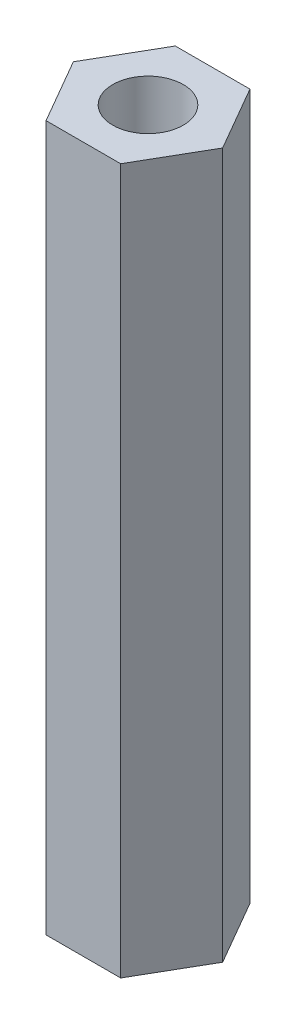
ISO-10303-21;
HEADER;
FILE_DESCRIPTION(('STEP AP214'),'2;1');
FILE_NAME('part.step','',(''),(''),'','','');
FILE_SCHEMA(('AUTOMOTIVE_DESIGN { 1 0 10303 214 1 1 1 1 }'));
ENDSEC;
DATA;
#1=APPLICATION_CONTEXT('core data for automotive mechanical design processes');
#2=APPLICATION_PROTOCOL_DEFINITION('international standard','automotive_design',2000,#1);
#3=PRODUCT_CONTEXT('',#1,'mechanical');
#4=PRODUCT('Part','Part','',(#3));
#5=PRODUCT_RELATED_PRODUCT_CATEGORY('part','',(#4));
#6=PRODUCT_DEFINITION_FORMATION('','',#4);
#7=PRODUCT_DEFINITION_CONTEXT('part definition',#1,'design');
#8=PRODUCT_DEFINITION('design','',#6,#7);
#9=PRODUCT_DEFINITION_SHAPE('','',#8);
#10=(LENGTH_UNIT() NAMED_UNIT(*) SI_UNIT(.MILLI.,.METRE.));
#11=(NAMED_UNIT(*) PLANE_ANGLE_UNIT() SI_UNIT($,.RADIAN.));
#12=(NAMED_UNIT(*) SI_UNIT($,.STERADIAN.) SOLID_ANGLE_UNIT());
#13=UNCERTAINTY_MEASURE_WITH_UNIT(LENGTH_MEASURE(1.E-05),#10,'distance_accuracy_value','');
#14=(GEOMETRIC_REPRESENTATION_CONTEXT(3) GLOBAL_UNCERTAINTY_ASSIGNED_CONTEXT((#13)) GLOBAL_UNIT_ASSIGNED_CONTEXT((#10,
#11,#12)) REPRESENTATION_CONTEXT('',''));
#15=CARTESIAN_POINT('',(0.,0.,0.));
#16=DIRECTION('',(0.,0.,1.));
#17=DIRECTION('',(1.,0.,0.));
#18=AXIS2_PLACEMENT_3D('',#15,#16,#17);
#19=CARTESIAN_POINT('',(1.5877132402715,30.,2.74999999999997));
#20=DIRECTION('',(-0.866025403784441,0.,-0.499999999999995));
#21=DIRECTION('',(-0.499999999999995,0.,0.866025403784442));
#22=AXIS2_PLACEMENT_3D('',#19,#20,#21);
#23=PLANE('',#22);
#24=DIRECTION('',(0.499999999999995,0.,-0.866025403784441));
#25=VECTOR('',#24,1.);
#26=CARTESIAN_POINT('',(1.5877132402715,0.,2.74999999999997));
#27=LINE('',#26,#25);
#28=CARTESIAN_POINT('',(1.5877132402715,0.,2.74999999999997));
#29=VERTEX_POINT('',#28);
#30=CARTESIAN_POINT('',(3.17542648054293,0.,0.));
#31=VERTEX_POINT('',#30);
#32=EDGE_CURVE('E117',#29,#31,#27,.T.);
#33=ORIENTED_EDGE('',*,*,#32,.T.);
#34=DIRECTION('',(0.,-1.,0.));
#35=VECTOR('',#34,1.);
#36=CARTESIAN_POINT('',(3.17542648054293,30.,0.));
#37=LINE('',#36,#35);
#38=CARTESIAN_POINT('',(3.17542648054293,30.,0.));
#39=VERTEX_POINT('',#38);
#40=EDGE_CURVE('E11',#39,#31,#37,.T.);
#41=ORIENTED_EDGE('',*,*,#40,.F.);
#42=DIRECTION('',(0.499999999999995,0.,-0.866025403784441));
#43=VECTOR('',#42,1.);
#44=CARTESIAN_POINT('',(1.5877132402715,30.,2.74999999999997));
#45=LINE('',#44,#43);
#46=CARTESIAN_POINT('',(1.5877132402715,30.,2.74999999999997));
#47=VERTEX_POINT('',#46);
#48=EDGE_CURVE('E128',#47,#39,#45,.T.);
#49=ORIENTED_EDGE('',*,*,#48,.F.);
#50=DIRECTION('',(0.,-1.,0.));
#51=VECTOR('',#50,1.);
#52=CARTESIAN_POINT('',(1.5877132402715,30.,2.74999999999997));
#53=LINE('',#52,#51);
#54=EDGE_CURVE('E113',#47,#29,#53,.T.);
#55=ORIENTED_EDGE('',*,*,#54,.T.);
#56=EDGE_LOOP('',(#33,#41,#49,#55));
#57=FACE_BOUND('',#56,.T.);
#58=ADVANCED_FACE('F33',(#57),#23,.F.);
#59=CARTESIAN_POINT('',(3.17542648054293,30.,0.));
#60=DIRECTION('',(-0.866025403784438,0.,0.500000000000001));
#61=DIRECTION('',(0.500000000000001,0.,0.866025403784438));
#62=AXIS2_PLACEMENT_3D('',#59,#60,#61);
#63=PLANE('',#62);
#64=DIRECTION('',(-0.500000000000001,0.,-0.866025403784438));
#65=VECTOR('',#64,1.);
#66=CARTESIAN_POINT('',(3.17542648054293,0.,0.));
#67=LINE('',#66,#65);
#68=CARTESIAN_POINT('',(1.58771324027146,0.,-2.74999999999999));
#69=VERTEX_POINT('',#68);
#70=EDGE_CURVE('E120',#31,#69,#67,.T.);
#71=ORIENTED_EDGE('',*,*,#70,.T.);
#72=DIRECTION('',(0.,-1.,0.));
#73=VECTOR('',#72,1.);
#74=CARTESIAN_POINT('',(1.58771324027146,30.,-2.74999999999999));
#75=LINE('',#74,#73);
#76=CARTESIAN_POINT('',(1.58771324027146,30.,-2.74999999999999));
#77=VERTEX_POINT('',#76);
#78=EDGE_CURVE('E41',#77,#69,#75,.T.);
#79=ORIENTED_EDGE('',*,*,#78,.F.);
#80=DIRECTION('',(-0.500000000000001,0.,-0.866025403784438));
#81=VECTOR('',#80,1.);
#82=CARTESIAN_POINT('',(3.17542648054293,30.,0.));
#83=LINE('',#82,#81);
#84=EDGE_CURVE('E86',#39,#77,#83,.T.);
#85=ORIENTED_EDGE('',*,*,#84,.F.);
#86=ORIENTED_EDGE('',*,*,#40,.T.);
#87=EDGE_LOOP('',(#71,#79,#85,#86));
#88=FACE_BOUND('',#87,.T.);
#89=ADVANCED_FACE('F153',(#88),#63,.F.);
#90=CARTESIAN_POINT('',(1.58771324027146,30.,-2.74999999999999));
#91=DIRECTION('',(0.,0.,1.));
#92=DIRECTION('',(1.,0.,0.));
#93=AXIS2_PLACEMENT_3D('',#90,#91,#92);
#94=PLANE('',#93);
#95=DIRECTION('',(-1.,0.,0.));
#96=VECTOR('',#95,1.);
#97=CARTESIAN_POINT('',(1.58771324027146,0.,-2.74999999999999));
#98=LINE('',#97,#96);
#99=CARTESIAN_POINT('',(-1.58771324027148,0.,-2.74999999999998));
#100=VERTEX_POINT('',#99);
#101=EDGE_CURVE('E123',#69,#100,#98,.T.);
#102=ORIENTED_EDGE('',*,*,#101,.T.);
#103=DIRECTION('',(0.,-1.,0.));
#104=VECTOR('',#103,1.);
#105=CARTESIAN_POINT('',(-1.58771324027148,30.,-2.74999999999998));
#106=LINE('',#105,#104);
#107=CARTESIAN_POINT('',(-1.58771324027148,30.,-2.74999999999998));
#108=VERTEX_POINT('',#107);
#109=EDGE_CURVE('E108',#108,#100,#106,.T.);
#110=ORIENTED_EDGE('',*,*,#109,.F.);
#111=DIRECTION('',(-1.,0.,0.));
#112=VECTOR('',#111,1.);
#113=CARTESIAN_POINT('',(1.58771324027146,30.,-2.74999999999999));
#114=LINE('',#113,#112);
#115=EDGE_CURVE('E99',#77,#108,#114,.T.);
#116=ORIENTED_EDGE('',*,*,#115,.F.);
#117=ORIENTED_EDGE('',*,*,#78,.T.);
#118=EDGE_LOOP('',(#102,#110,#116,#117));
#119=FACE_BOUND('',#118,.T.);
#120=ADVANCED_FACE('F134',(#119),#94,.F.);
#121=CARTESIAN_POINT('',(-1.58771324027148,30.,-2.74999999999998));
#122=DIRECTION('',(0.866025403784442,0.,0.499999999999995));
#123=DIRECTION('',(0.499999999999995,0.,-0.866025403784442));
#124=AXIS2_PLACEMENT_3D('',#121,#122,#123);
#125=PLANE('',#124);
#126=DIRECTION('',(-0.499999999999995,0.,0.866025403784442));
#127=VECTOR('',#126,1.);
#128=CARTESIAN_POINT('',(-1.58771324027148,0.,-2.74999999999998));
#129=LINE('',#128,#127);
#130=CARTESIAN_POINT('',(-3.17542648054293,0.,0.));
#131=VERTEX_POINT('',#130);
#132=EDGE_CURVE('E107',#100,#131,#129,.T.);
#133=ORIENTED_EDGE('',*,*,#132,.T.);
#134=DIRECTION('',(0.,-1.,0.));
#135=VECTOR('',#134,1.);
#136=CARTESIAN_POINT('',(-3.17542648054293,30.,0.));
#137=LINE('',#136,#135);
#138=CARTESIAN_POINT('',(-3.17542648054293,30.,0.));
#139=VERTEX_POINT('',#138);
#140=EDGE_CURVE('E104',#139,#131,#137,.T.);
#141=ORIENTED_EDGE('',*,*,#140,.F.);
#142=DIRECTION('',(-0.499999999999995,0.,0.866025403784442));
#143=VECTOR('',#142,1.);
#144=CARTESIAN_POINT('',(-1.58771324027148,30.,-2.74999999999998));
#145=LINE('',#144,#143);
#146=EDGE_CURVE('E93',#108,#139,#145,.T.);
#147=ORIENTED_EDGE('',*,*,#146,.F.);
#148=ORIENTED_EDGE('',*,*,#109,.T.);
#149=EDGE_LOOP('',(#133,#141,#147,#148));
#150=FACE_BOUND('',#149,.T.);
#151=ADVANCED_FACE('F105',(#150),#125,.F.);
#152=CARTESIAN_POINT('',(-3.17542648054293,30.,0.));
#153=DIRECTION('',(0.866025403784435,0.,-0.500000000000007));
#154=DIRECTION('',(-0.500000000000007,0.,-0.866025403784435));
#155=AXIS2_PLACEMENT_3D('',#152,#153,#154);
#156=PLANE('',#155);
#157=DIRECTION('',(0.500000000000007,0.,0.866025403784435));
#158=VECTOR('',#157,1.);
#159=CARTESIAN_POINT('',(-3.17542648054293,0.,0.));
#160=LINE('',#159,#158);
#161=CARTESIAN_POINT('',(-1.58771324027144,0.,2.75));
#162=VERTEX_POINT('',#161);
#163=EDGE_CURVE('E72',#131,#162,#160,.T.);
#164=ORIENTED_EDGE('',*,*,#163,.T.);
#165=DIRECTION('',(0.,-1.,0.));
#166=VECTOR('',#165,1.);
#167=CARTESIAN_POINT('',(-1.58771324027144,30.,2.75));
#168=LINE('',#167,#166);
#169=CARTESIAN_POINT('',(-1.58771324027144,30.,2.75));
#170=VERTEX_POINT('',#169);
#171=EDGE_CURVE('E109',#170,#162,#168,.T.);
#172=ORIENTED_EDGE('',*,*,#171,.F.);
#173=DIRECTION('',(0.500000000000007,0.,0.866025403784435));
#174=VECTOR('',#173,1.);
#175=CARTESIAN_POINT('',(-3.17542648054293,30.,0.));
#176=LINE('',#175,#174);
#177=EDGE_CURVE('E97',#139,#170,#176,.T.);
#178=ORIENTED_EDGE('',*,*,#177,.F.);
#179=ORIENTED_EDGE('',*,*,#140,.T.);
#180=EDGE_LOOP('',(#164,#172,#178,#179));
#181=FACE_BOUND('',#180,.T.);
#182=ADVANCED_FACE('F111',(#181),#156,.F.);
#183=CARTESIAN_POINT('',(-1.58771324027144,30.,2.75));
#184=DIRECTION('',(0.,0.,-1.));
#185=DIRECTION('',(-1.,0.,0.));
#186=AXIS2_PLACEMENT_3D('',#183,#184,#185);
#187=PLANE('',#186);
#188=DIRECTION('',(1.,0.,0.));
#189=VECTOR('',#188,1.);
#190=CARTESIAN_POINT('',(-1.58771324027144,0.,2.75));
#191=LINE('',#190,#189);
#192=EDGE_CURVE('E78',#162,#29,#191,.T.);
#193=ORIENTED_EDGE('',*,*,#192,.T.);
#194=ORIENTED_EDGE('',*,*,#54,.F.);
#195=DIRECTION('',(1.,0.,0.));
#196=VECTOR('',#195,1.);
#197=CARTESIAN_POINT('',(-1.58771324027144,30.,2.75));
#198=LINE('',#197,#196);
#199=EDGE_CURVE('E49',#170,#47,#198,.T.);
#200=ORIENTED_EDGE('',*,*,#199,.F.);
#201=ORIENTED_EDGE('',*,*,#171,.T.);
#202=EDGE_LOOP('',(#193,#194,#200,#201));
#203=FACE_BOUND('',#202,.T.);
#204=ADVANCED_FACE('F141',(#203),#187,.F.);
#205=CARTESIAN_POINT('',(0.,30.,0.));
#206=DIRECTION('',(0.,1.,0.));
#207=DIRECTION('',(0.,0.,1.));
#208=AXIS2_PLACEMENT_3D('',#205,#206,#207);
#209=PLANE('',#208);
#210=CARTESIAN_POINT('',(0.,30.,0.));
#211=DIRECTION('',(0.,1.,0.));
#212=DIRECTION('',(0.,0.,1.));
#213=AXIS2_PLACEMENT_3D('',#210,#211,#212);
#214=CIRCLE('',#213,1.5);
#215=CARTESIAN_POINT('',(0.,30.,1.5));
#216=VERTEX_POINT('',#215);
#217=EDGE_CURVE('E236',#216,#216,#214,.T.);
#218=ORIENTED_EDGE('',*,*,#217,.F.);
#219=EDGE_LOOP('',(#218));
#220=FACE_BOUND('',#219,.T.);
#221=ORIENTED_EDGE('',*,*,#48,.T.);
#222=ORIENTED_EDGE('',*,*,#84,.T.);
#223=ORIENTED_EDGE('',*,*,#115,.T.);
#224=ORIENTED_EDGE('',*,*,#146,.T.);
#225=ORIENTED_EDGE('',*,*,#177,.T.);
#226=ORIENTED_EDGE('',*,*,#199,.T.);
#227=EDGE_LOOP('',(#221,#222,#223,#224,#225,#226));
#228=FACE_BOUND('',#227,.T.);
#229=ADVANCED_FACE('F95',(#220,#228),#209,.T.);
#230=CARTESIAN_POINT('',(0.,0.,0.));
#231=DIRECTION('',(0.,1.,0.));
#232=DIRECTION('',(0.,0.,1.));
#233=AXIS2_PLACEMENT_3D('',#230,#231,#232);
#234=PLANE('',#233);
#235=CARTESIAN_POINT('',(0.,0.,0.));
#236=DIRECTION('',(0.,1.,0.));
#237=DIRECTION('',(0.,0.,1.));
#238=AXIS2_PLACEMENT_3D('',#235,#236,#237);
#239=CIRCLE('',#238,1.5);
#240=CARTESIAN_POINT('',(0.,0.,1.5));
#241=VERTEX_POINT('',#240);
#242=EDGE_CURVE('E237',#241,#241,#239,.T.);
#243=ORIENTED_EDGE('',*,*,#242,.T.);
#244=EDGE_LOOP('',(#243));
#245=FACE_BOUND('',#244,.T.);
#246=ORIENTED_EDGE('',*,*,#32,.F.);
#247=ORIENTED_EDGE('',*,*,#192,.F.);
#248=ORIENTED_EDGE('',*,*,#163,.F.);
#249=ORIENTED_EDGE('',*,*,#132,.F.);
#250=ORIENTED_EDGE('',*,*,#101,.F.);
#251=ORIENTED_EDGE('',*,*,#70,.F.);
#252=EDGE_LOOP('',(#246,#247,#248,#249,#250,#251));
#253=FACE_BOUND('',#252,.T.);
#254=ADVANCED_FACE('F137',(#245,#253),#234,.F.);
#255=CARTESIAN_POINT('',(0.,20.,0.));
#256=DIRECTION('',(0.,1.,0.));
#257=DIRECTION('',(0.,0.,1.));
#258=AXIS2_PLACEMENT_3D('',#255,#256,#257);
#259=CYLINDRICAL_SURFACE('',#258,1.5);
#260=CARTESIAN_POINT('',(0.,20.,0.));
#261=DIRECTION('',(0.,1.,0.));
#262=DIRECTION('',(0.,0.,1.));
#263=AXIS2_PLACEMENT_3D('',#260,#261,#262);
#264=CIRCLE('',#263,1.5);
#265=CARTESIAN_POINT('',(0.,20.,1.5));
#266=VERTEX_POINT('',#265);
#267=EDGE_CURVE('E121',#266,#266,#264,.T.);
#268=ORIENTED_EDGE('',*,*,#267,.F.);
#269=EDGE_LOOP('',(#268));
#270=FACE_BOUND('',#269,.T.);
#271=ORIENTED_EDGE('',*,*,#217,.T.);
#272=EDGE_LOOP('',(#271));
#273=FACE_BOUND('',#272,.T.);
#274=ADVANCED_FACE('F188',(#270,#273),#259,.F.);
#275=CARTESIAN_POINT('',(0.,20.,0.));
#276=DIRECTION('',(0.,1.,0.));
#277=DIRECTION('',(0.,0.,1.));
#278=AXIS2_PLACEMENT_3D('',#275,#276,#277);
#279=PLANE('',#278);
#280=ORIENTED_EDGE('',*,*,#267,.T.);
#281=EDGE_LOOP('',(#280));
#282=FACE_BOUND('',#281,.T.);
#283=ADVANCED_FACE('F193',(#282),#279,.T.);
#284=CARTESIAN_POINT('',(0.,10.,0.));
#285=DIRECTION('',(0.,-1.,0.));
#286=DIRECTION('',(0.,0.,-1.));
#287=AXIS2_PLACEMENT_3D('',#284,#285,#286);
#288=CYLINDRICAL_SURFACE('',#287,1.5);
#289=CARTESIAN_POINT('',(0.,10.,0.));
#290=DIRECTION('',(0.,1.,0.));
#291=DIRECTION('',(0.,0.,1.));
#292=AXIS2_PLACEMENT_3D('',#289,#290,#291);
#293=CIRCLE('',#292,1.5);
#294=CARTESIAN_POINT('',(0.,10.,1.5));
#295=VERTEX_POINT('',#294);
#296=EDGE_CURVE('E235',#295,#295,#293,.T.);
#297=ORIENTED_EDGE('',*,*,#296,.T.);
#298=EDGE_LOOP('',(#297));
#299=FACE_BOUND('',#298,.T.);
#300=ORIENTED_EDGE('',*,*,#242,.F.);
#301=EDGE_LOOP('',(#300));
#302=FACE_BOUND('',#301,.T.);
#303=ADVANCED_FACE('F203',(#299,#302),#288,.F.);
#304=CARTESIAN_POINT('',(0.,10.,0.));
#305=DIRECTION('',(0.,-1.,0.));
#306=DIRECTION('',(0.,0.,1.));
#307=AXIS2_PLACEMENT_3D('',#304,#305,#306);
#308=PLANE('',#307);
#309=ORIENTED_EDGE('',*,*,#296,.F.);
#310=EDGE_LOOP('',(#309));
#311=FACE_BOUND('',#310,.T.);
#312=ADVANCED_FACE('F219',(#311),#308,.T.);
#313=CLOSED_SHELL('',(#58,#89,#120,#151,#182,#204,#229,#254,#274,#283,#303,#312));
#314=MANIFOLD_SOLID_BREP('B2',#313);
#315=ADVANCED_BREP_SHAPE_REPRESENTATION('',(#18,#314),#14);
#316=SHAPE_DEFINITION_REPRESENTATION(#9,#315);
ENDSEC;
END-ISO-10303-21;
